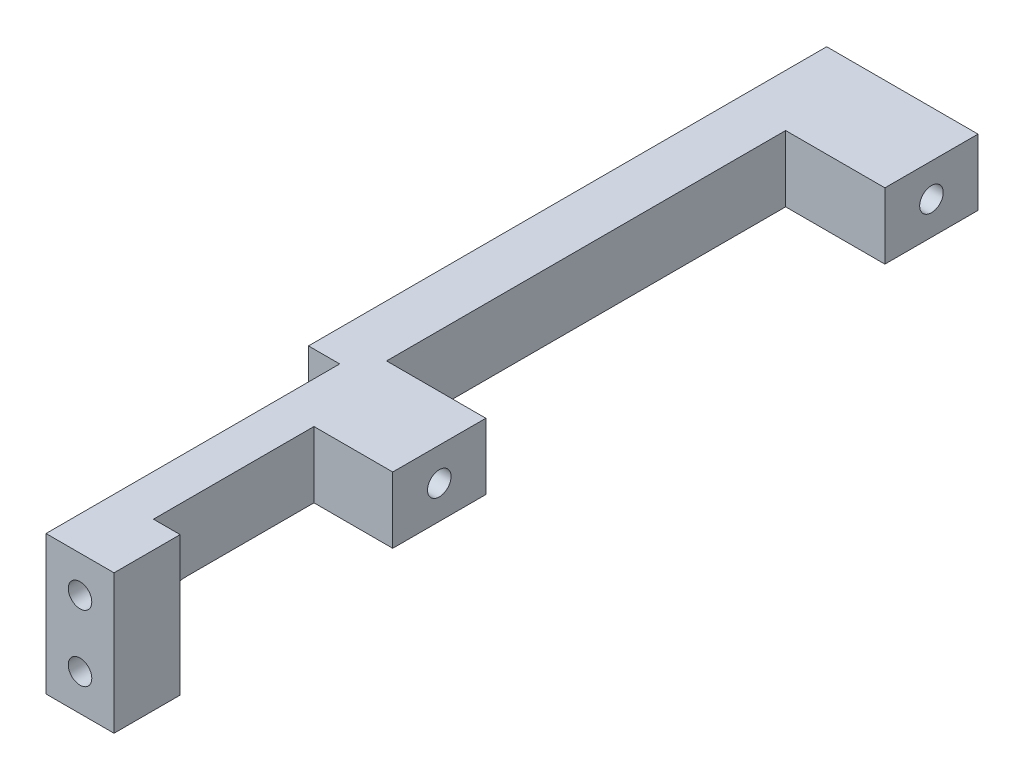
ISO-10303-21;
HEADER;
FILE_DESCRIPTION(('STEP AP214'),'2;1');
FILE_NAME('part.step','',(''),(''),'','','');
FILE_SCHEMA(('AUTOMOTIVE_DESIGN { 1 0 10303 214 1 1 1 1 }'));
ENDSEC;
DATA;
#1=APPLICATION_CONTEXT('core data for automotive mechanical design processes');
#2=APPLICATION_PROTOCOL_DEFINITION('international standard','automotive_design',2000,#1);
#3=PRODUCT_CONTEXT('',#1,'mechanical');
#4=PRODUCT('Part','Part','',(#3));
#5=PRODUCT_RELATED_PRODUCT_CATEGORY('part','',(#4));
#6=PRODUCT_DEFINITION_FORMATION('','',#4);
#7=PRODUCT_DEFINITION_CONTEXT('part definition',#1,'design');
#8=PRODUCT_DEFINITION('design','',#6,#7);
#9=PRODUCT_DEFINITION_SHAPE('','',#8);
#10=(LENGTH_UNIT() NAMED_UNIT(*) SI_UNIT(.MILLI.,.METRE.));
#11=(NAMED_UNIT(*) PLANE_ANGLE_UNIT() SI_UNIT($,.RADIAN.));
#12=(NAMED_UNIT(*) SI_UNIT($,.STERADIAN.) SOLID_ANGLE_UNIT());
#13=UNCERTAINTY_MEASURE_WITH_UNIT(LENGTH_MEASURE(1.E-05),#10,'distance_accuracy_value','');
#14=(GEOMETRIC_REPRESENTATION_CONTEXT(3) GLOBAL_UNCERTAINTY_ASSIGNED_CONTEXT((#13)) GLOBAL_UNIT_ASSIGNED_CONTEXT((#10,
#11,#12)) REPRESENTATION_CONTEXT('',''));
#15=CARTESIAN_POINT('',(0.,0.,0.));
#16=DIRECTION('',(0.,0.,1.));
#17=DIRECTION('',(1.,0.,0.));
#18=AXIS2_PLACEMENT_3D('',#15,#16,#17);
#19=CARTESIAN_POINT('',(0.,0.,0.));
#20=DIRECTION('',(0.,1.,0.));
#21=DIRECTION('',(0.,0.,1.));
#22=AXIS2_PLACEMENT_3D('',#19,#20,#21);
#23=PLANE('',#22);
#24=DIRECTION('',(0.,0.,1.));
#25=VECTOR('',#24,1.);
#26=CARTESIAN_POINT('',(-1.79845000000001,0.,32.639));
#27=LINE('',#26,#25);
#28=CARTESIAN_POINT('',(-1.79845000000001,0.,17.2212));
#29=VERTEX_POINT('',#28);
#30=CARTESIAN_POINT('',(-1.79845000000001,0.,29.464));
#31=VERTEX_POINT('',#30);
#32=EDGE_CURVE('E259',#29,#31,#27,.T.);
#33=ORIENTED_EDGE('',*,*,#32,.T.);
#34=DIRECTION('',(1.,0.,0.));
#35=VECTOR('',#34,1.);
#36=CARTESIAN_POINT('',(-5.7672,0.,29.464));
#37=LINE('',#36,#35);
#38=CARTESIAN_POINT('',(-5.7672,0.,29.464));
#39=VERTEX_POINT('',#38);
#40=EDGE_CURVE('E59',#31,#39,#37,.F.);
#41=ORIENTED_EDGE('',*,*,#40,.T.);
#42=DIRECTION('',(0.,0.,1.));
#43=VECTOR('',#42,1.);
#44=CARTESIAN_POINT('',(-5.76720000000001,0.,-38.989));
#45=LINE('',#44,#43);
#46=CARTESIAN_POINT('',(-5.7672,0.,10.7804));
#47=VERTEX_POINT('',#46);
#48=EDGE_CURVE('E289',#47,#39,#45,.T.);
#49=ORIENTED_EDGE('',*,*,#48,.F.);
#50=DIRECTION('',(-1.,0.,0.));
#51=VECTOR('',#50,1.);
#52=CARTESIAN_POINT('',(-8.76720000000001,0.,10.7804));
#53=LINE('',#52,#51);
#54=CARTESIAN_POINT('',(-8.76720000000001,0.,10.7804));
#55=VERTEX_POINT('',#54);
#56=EDGE_CURVE('E188',#47,#55,#53,.T.);
#57=ORIENTED_EDGE('',*,*,#56,.T.);
#58=DIRECTION('',(0.,0.,-1.));
#59=VECTOR('',#58,1.);
#60=CARTESIAN_POINT('',(-8.76720000000001,0.,10.7804));
#61=LINE('',#60,#59);
#62=CARTESIAN_POINT('',(-8.7672,0.,-38.989));
#63=VERTEX_POINT('',#62);
#64=EDGE_CURVE('E179',#55,#63,#61,.T.);
#65=ORIENTED_EDGE('',*,*,#64,.T.);
#66=DIRECTION('',(-1.,0.,0.));
#67=VECTOR('',#66,1.);
#68=CARTESIAN_POINT('',(-5.76720000000001,0.,-38.989));
#69=LINE('',#68,#67);
#70=CARTESIAN_POINT('',(5.76719999999999,0.,-38.989));
#71=VERTEX_POINT('',#70);
#72=EDGE_CURVE('E299',#71,#63,#69,.T.);
#73=ORIENTED_EDGE('',*,*,#72,.F.);
#74=DIRECTION('',(0.,0.,-1.));
#75=VECTOR('',#74,1.);
#76=CARTESIAN_POINT('',(5.76719999999999,0.,-38.989));
#77=LINE('',#76,#75);
#78=CARTESIAN_POINT('',(5.7672,0.,-30.0482));
#79=VERTEX_POINT('',#78);
#80=EDGE_CURVE('E285',#79,#71,#77,.T.);
#81=ORIENTED_EDGE('',*,*,#80,.F.);
#82=DIRECTION('',(-1.,0.,0.));
#83=VECTOR('',#82,1.);
#84=CARTESIAN_POINT('',(-3.76720000000001,0.,-30.0482));
#85=LINE('',#84,#83);
#86=CARTESIAN_POINT('',(-3.76720000000001,0.,-30.0482));
#87=VERTEX_POINT('',#86);
#88=EDGE_CURVE('E228',#79,#87,#85,.T.);
#89=ORIENTED_EDGE('',*,*,#88,.T.);
#90=DIRECTION('',(0.,0.,1.));
#91=VECTOR('',#90,1.);
#92=CARTESIAN_POINT('',(-3.76720000000001,0.,-30.0482));
#93=LINE('',#92,#91);
#94=CARTESIAN_POINT('',(-3.7672,0.,8.2804));
#95=VERTEX_POINT('',#94);
#96=EDGE_CURVE('E231',#87,#95,#93,.T.);
#97=ORIENTED_EDGE('',*,*,#96,.T.);
#98=DIRECTION('',(1.,0.,0.));
#99=VECTOR('',#98,1.);
#100=CARTESIAN_POINT('',(-3.7672,0.,8.2804));
#101=LINE('',#100,#99);
#102=CARTESIAN_POINT('',(5.76720000000001,0.,8.2804));
#103=VERTEX_POINT('',#102);
#104=EDGE_CURVE('E235',#95,#103,#101,.T.);
#105=ORIENTED_EDGE('',*,*,#104,.T.);
#106=CARTESIAN_POINT('',(5.76720000000001,0.,17.2212));
#107=VERTEX_POINT('',#106);
#108=EDGE_CURVE('E298',#107,#103,#77,.T.);
#109=ORIENTED_EDGE('',*,*,#108,.F.);
#110=DIRECTION('',(-1.,0.,0.));
#111=VECTOR('',#110,1.);
#112=CARTESIAN_POINT('',(-1.79845000000001,0.,17.2212));
#113=LINE('',#112,#111);
#114=EDGE_CURVE('E256',#107,#29,#113,.T.);
#115=ORIENTED_EDGE('',*,*,#114,.T.);
#116=EDGE_LOOP('',(#33,#41,#49,#57,#65,#73,#81,#89,#97,#105,#109,#115));
#117=FACE_BOUND('',#116,.T.);
#118=ADVANCED_FACE('F38',(#117),#23,.F.);
#119=CARTESIAN_POINT('',(5.76719999999999,6.35,-38.989));
#120=DIRECTION('',(-1.,0.,0.));
#121=DIRECTION('',(0.,0.,1.));
#122=AXIS2_PLACEMENT_3D('',#119,#120,#121);
#123=PLANE('',#122);
#124=CARTESIAN_POINT('',(5.7672,3.17499999999999,12.7508));
#125=DIRECTION('',(1.,0.,0.));
#126=DIRECTION('',(0.,0.,-1.));
#127=AXIS2_PLACEMENT_3D('',#124,#125,#126);
#128=CIRCLE('',#127,1.13029999999999);
#129=CARTESIAN_POINT('',(5.7672,3.17499999999999,11.6205));
#130=VERTEX_POINT('',#129);
#131=EDGE_CURVE('E279',#130,#130,#128,.T.);
#132=ORIENTED_EDGE('',*,*,#131,.F.);
#133=EDGE_LOOP('',(#132));
#134=FACE_BOUND('',#133,.T.);
#135=ORIENTED_EDGE('',*,*,#108,.T.);
#136=DIRECTION('',(0.,1.,0.));
#137=VECTOR('',#136,1.);
#138=CARTESIAN_POINT('',(5.76720000000001,0.,8.2804));
#139=LINE('',#138,#137);
#140=CARTESIAN_POINT('',(5.76720000000001,6.35,8.2804));
#141=VERTEX_POINT('',#140);
#142=EDGE_CURVE('E247',#103,#141,#139,.T.);
#143=ORIENTED_EDGE('',*,*,#142,.T.);
#144=DIRECTION('',(0.,0.,-1.));
#145=VECTOR('',#144,1.);
#146=CARTESIAN_POINT('',(5.76719999999999,6.35,-38.989));
#147=LINE('',#146,#145);
#148=CARTESIAN_POINT('',(5.76720000000001,6.35,17.2212));
#149=VERTEX_POINT('',#148);
#150=EDGE_CURVE('E288',#149,#141,#147,.T.);
#151=ORIENTED_EDGE('',*,*,#150,.F.);
#152=DIRECTION('',(0.,1.,0.));
#153=VECTOR('',#152,1.);
#154=CARTESIAN_POINT('',(5.76720000000001,0.,17.2212));
#155=LINE('',#154,#153);
#156=EDGE_CURVE('E262',#107,#149,#155,.T.);
#157=ORIENTED_EDGE('',*,*,#156,.F.);
#158=EDGE_LOOP('',(#135,#143,#151,#157));
#159=FACE_BOUND('',#158,.T.);
#160=ADVANCED_FACE('F342',(#134,#159),#123,.F.);
#161=CARTESIAN_POINT('',(5.7672,3.175,-34.5186));
#162=DIRECTION('',(1.,0.,0.));
#163=DIRECTION('',(0.,0.,-1.));
#164=AXIS2_PLACEMENT_3D('',#161,#162,#163);
#165=CIRCLE('',#164,1.13029999999999);
#166=CARTESIAN_POINT('',(5.7672,3.175,-35.6489));
#167=VERTEX_POINT('',#166);
#168=EDGE_CURVE('E250',#167,#167,#165,.T.);
#169=ORIENTED_EDGE('',*,*,#168,.F.);
#170=EDGE_LOOP('',(#169));
#171=FACE_BOUND('',#170,.T.);
#172=CARTESIAN_POINT('',(5.7672,6.35,-30.0482));
#173=VERTEX_POINT('',#172);
#174=CARTESIAN_POINT('',(5.76719999999999,6.35,-38.989));
#175=VERTEX_POINT('',#174);
#176=EDGE_CURVE('E286',#173,#175,#147,.T.);
#177=ORIENTED_EDGE('',*,*,#176,.F.);
#178=DIRECTION('',(0.,1.,0.));
#179=VECTOR('',#178,1.);
#180=CARTESIAN_POINT('',(5.7672,0.,-30.0482));
#181=LINE('',#180,#179);
#182=EDGE_CURVE('E238',#79,#173,#181,.T.);
#183=ORIENTED_EDGE('',*,*,#182,.F.);
#184=ORIENTED_EDGE('',*,*,#80,.T.);
#185=DIRECTION('',(0.,-1.,0.));
#186=VECTOR('',#185,1.);
#187=CARTESIAN_POINT('',(5.76719999999999,6.35,-38.989));
#188=LINE('',#187,#186);
#189=EDGE_CURVE('E303',#175,#71,#188,.T.);
#190=ORIENTED_EDGE('',*,*,#189,.F.);
#191=EDGE_LOOP('',(#177,#183,#184,#190));
#192=FACE_BOUND('',#191,.T.);
#193=ADVANCED_FACE('F325',(#171,#192),#123,.F.);
#194=CARTESIAN_POINT('',(-5.76720000000001,6.35,-38.989));
#195=DIRECTION('',(0.,0.,1.));
#196=DIRECTION('',(1.,0.,0.));
#197=AXIS2_PLACEMENT_3D('',#194,#195,#196);
#198=PLANE('',#197);
#199=ORIENTED_EDGE('',*,*,#72,.T.);
#200=DIRECTION('',(0.,-1.,0.));
#201=VECTOR('',#200,1.);
#202=CARTESIAN_POINT('',(-8.7672,56.2097350209565,-38.989));
#203=LINE('',#202,#201);
#204=CARTESIAN_POINT('',(-8.7672,6.35,-38.989));
#205=VERTEX_POINT('',#204);
#206=EDGE_CURVE('E173',#205,#63,#203,.T.);
#207=ORIENTED_EDGE('',*,*,#206,.F.);
#208=DIRECTION('',(-1.,0.,0.));
#209=VECTOR('',#208,1.);
#210=CARTESIAN_POINT('',(-5.76720000000001,6.35,-38.989));
#211=LINE('',#210,#209);
#212=EDGE_CURVE('E169',#175,#205,#211,.T.);
#213=ORIENTED_EDGE('',*,*,#212,.F.);
#214=ORIENTED_EDGE('',*,*,#189,.T.);
#215=EDGE_LOOP('',(#199,#207,#213,#214));
#216=FACE_BOUND('',#215,.T.);
#217=ADVANCED_FACE('F322',(#216),#198,.F.);
#218=CARTESIAN_POINT('',(-5.76720000000001,6.35,-38.989));
#219=DIRECTION('',(1.,0.,0.));
#220=DIRECTION('',(0.,0.,-1.));
#221=AXIS2_PLACEMENT_3D('',#218,#219,#220);
#222=PLANE('',#221);
#223=DIRECTION('',(0.,0.,1.));
#224=VECTOR('',#223,1.);
#225=CARTESIAN_POINT('',(-5.76720000000001,6.35,-38.989));
#226=LINE('',#225,#224);
#227=CARTESIAN_POINT('',(-5.76720000000001,6.35,10.7804));
#228=VERTEX_POINT('',#227);
#229=CARTESIAN_POINT('',(-5.7672,6.35,38.989));
#230=VERTEX_POINT('',#229);
#231=EDGE_CURVE('E291',#228,#230,#226,.T.);
#232=ORIENTED_EDGE('',*,*,#231,.F.);
#233=DIRECTION('',(0.,-1.,0.));
#234=VECTOR('',#233,1.);
#235=CARTESIAN_POINT('',(-5.76720000000001,56.2097350209565,10.7804));
#236=LINE('',#235,#234);
#237=EDGE_CURVE('E185',#228,#47,#236,.T.);
#238=ORIENTED_EDGE('',*,*,#237,.T.);
#239=ORIENTED_EDGE('',*,*,#48,.T.);
#240=CARTESIAN_POINT('',(-5.7672,-3.175,29.464));
#241=DIRECTION('',(1.,0.,0.));
#242=DIRECTION('',(0.,0.,-1.));
#243=AXIS2_PLACEMENT_3D('',#240,#241,#242);
#244=CIRCLE('',#243,3.175);
#245=CARTESIAN_POINT('',(-5.7672,-3.175,32.639));
#246=VERTEX_POINT('',#245);
#247=EDGE_CURVE('E11',#39,#246,#244,.T.);
#248=ORIENTED_EDGE('',*,*,#247,.T.);
#249=DIRECTION('',(0.,1.,0.));
#250=VECTOR('',#249,1.);
#251=CARTESIAN_POINT('',(-5.7672,-7.,32.639));
#252=LINE('',#251,#250);
#253=CARTESIAN_POINT('',(-5.7672,-7.,32.639));
#254=VERTEX_POINT('',#253);
#255=EDGE_CURVE('E207',#254,#246,#252,.T.);
#256=ORIENTED_EDGE('',*,*,#255,.F.);
#257=DIRECTION('',(0.,0.,1.));
#258=VECTOR('',#257,1.);
#259=CARTESIAN_POINT('',(-5.7672,-7.,23.0630727153972));
#260=LINE('',#259,#258);
#261=CARTESIAN_POINT('',(-5.7672,-7.,38.989));
#262=VERTEX_POINT('',#261);
#263=EDGE_CURVE('E216',#254,#262,#260,.T.);
#264=ORIENTED_EDGE('',*,*,#263,.T.);
#265=DIRECTION('',(0.,-1.,0.));
#266=VECTOR('',#265,1.);
#267=CARTESIAN_POINT('',(-5.7672,6.35,38.989));
#268=LINE('',#267,#266);
#269=EDGE_CURVE('E296',#230,#262,#268,.T.);
#270=ORIENTED_EDGE('',*,*,#269,.F.);
#271=EDGE_LOOP('',(#232,#238,#239,#248,#256,#264,#270));
#272=FACE_BOUND('',#271,.T.);
#273=ADVANCED_FACE('F316',(#272),#222,.F.);
#274=CARTESIAN_POINT('',(-5.7672,6.35,38.989));
#275=DIRECTION('',(0.,0.,-1.));
#276=DIRECTION('',(-1.,0.,0.));
#277=AXIS2_PLACEMENT_3D('',#274,#275,#276);
#278=PLANE('',#277);
#279=CARTESIAN_POINT('',(-2.49999999999999,2.85,38.989));
#280=DIRECTION('',(0.,0.,1.));
#281=DIRECTION('',(1.,0.,0.));
#282=AXIS2_PLACEMENT_3D('',#279,#280,#281);
#283=CIRCLE('',#282,1.13029999999999);
#284=CARTESIAN_POINT('',(-1.36970000000001,2.85,38.989));
#285=VERTEX_POINT('',#284);
#286=EDGE_CURVE('E194',#285,#285,#283,.T.);
#287=ORIENTED_EDGE('',*,*,#286,.F.);
#288=EDGE_LOOP('',(#287));
#289=FACE_BOUND('',#288,.T.);
#290=CARTESIAN_POINT('',(-2.49999999999999,-3.5,38.989));
#291=DIRECTION('',(0.,0.,1.));
#292=DIRECTION('',(1.,0.,0.));
#293=AXIS2_PLACEMENT_3D('',#290,#291,#292);
#294=CIRCLE('',#293,1.13029999999999);
#295=CARTESIAN_POINT('',(-1.36970000000001,-3.5,38.989));
#296=VERTEX_POINT('',#295);
#297=EDGE_CURVE('E200',#296,#296,#294,.T.);
#298=ORIENTED_EDGE('',*,*,#297,.F.);
#299=EDGE_LOOP('',(#298));
#300=FACE_BOUND('',#299,.T.);
#301=ORIENTED_EDGE('',*,*,#269,.T.);
#302=DIRECTION('',(1.,0.,0.));
#303=VECTOR('',#302,1.);
#304=CARTESIAN_POINT('',(-5.7672,-7.,38.989));
#305=LINE('',#304,#303);
#306=CARTESIAN_POINT('',(0.767200000000005,-7.,38.989));
#307=VERTEX_POINT('',#306);
#308=EDGE_CURVE('E206',#262,#307,#305,.T.);
#309=ORIENTED_EDGE('',*,*,#308,.T.);
#310=DIRECTION('',(0.,1.,0.));
#311=VECTOR('',#310,1.);
#312=CARTESIAN_POINT('',(0.767200000000005,0.,38.989));
#313=LINE('',#312,#311);
#314=CARTESIAN_POINT('',(0.767200000000005,6.35,38.989));
#315=VERTEX_POINT('',#314);
#316=EDGE_CURVE('E223',#307,#315,#313,.T.);
#317=ORIENTED_EDGE('',*,*,#316,.T.);
#318=DIRECTION('',(1.,0.,0.));
#319=VECTOR('',#318,1.);
#320=CARTESIAN_POINT('',(-5.7672,6.35,38.989));
#321=LINE('',#320,#319);
#322=EDGE_CURVE('E293',#230,#315,#321,.T.);
#323=ORIENTED_EDGE('',*,*,#322,.F.);
#324=EDGE_LOOP('',(#301,#309,#317,#323));
#325=FACE_BOUND('',#324,.T.);
#326=ADVANCED_FACE('F370',(#289,#300,#325),#278,.F.);
#327=CARTESIAN_POINT('',(0.,6.35,0.));
#328=DIRECTION('',(0.,1.,0.));
#329=DIRECTION('',(0.,0.,1.));
#330=AXIS2_PLACEMENT_3D('',#327,#328,#329);
#331=PLANE('',#330);
#332=DIRECTION('',(0.,0.,1.));
#333=VECTOR('',#332,1.);
#334=CARTESIAN_POINT('',(0.767200000000005,6.35,38.989));
#335=LINE('',#334,#333);
#336=CARTESIAN_POINT('',(0.767200000000005,6.35,32.639));
#337=VERTEX_POINT('',#336);
#338=EDGE_CURVE('E213',#337,#315,#335,.T.);
#339=ORIENTED_EDGE('',*,*,#338,.F.);
#340=DIRECTION('',(1.,0.,0.));
#341=VECTOR('',#340,1.);
#342=CARTESIAN_POINT('',(-1.79845000000001,6.35,32.639));
#343=LINE('',#342,#341);
#344=CARTESIAN_POINT('',(-1.79845000000001,6.35,32.639));
#345=VERTEX_POINT('',#344);
#346=EDGE_CURVE('E260',#345,#337,#343,.T.);
#347=ORIENTED_EDGE('',*,*,#346,.F.);
#348=DIRECTION('',(0.,0.,1.));
#349=VECTOR('',#348,1.);
#350=CARTESIAN_POINT('',(-1.79845000000001,6.35,32.639));
#351=LINE('',#350,#349);
#352=CARTESIAN_POINT('',(-1.79845000000001,6.35,17.2212));
#353=VERTEX_POINT('',#352);
#354=EDGE_CURVE('E265',#353,#345,#351,.T.);
#355=ORIENTED_EDGE('',*,*,#354,.F.);
#356=DIRECTION('',(-1.,0.,0.));
#357=VECTOR('',#356,1.);
#358=CARTESIAN_POINT('',(-1.79845000000001,6.35,17.2212));
#359=LINE('',#358,#357);
#360=EDGE_CURVE('E226',#149,#353,#359,.T.);
#361=ORIENTED_EDGE('',*,*,#360,.F.);
#362=ORIENTED_EDGE('',*,*,#150,.T.);
#363=DIRECTION('',(1.,0.,0.));
#364=VECTOR('',#363,1.);
#365=CARTESIAN_POINT('',(-3.7672,6.35,8.2804));
#366=LINE('',#365,#364);
#367=CARTESIAN_POINT('',(-3.7672,6.35,8.2804));
#368=VERTEX_POINT('',#367);
#369=EDGE_CURVE('E232',#368,#141,#366,.T.);
#370=ORIENTED_EDGE('',*,*,#369,.F.);
#371=DIRECTION('',(0.,0.,1.));
#372=VECTOR('',#371,1.);
#373=CARTESIAN_POINT('',(-3.76720000000001,6.35,-30.0482));
#374=LINE('',#373,#372);
#375=CARTESIAN_POINT('',(-3.76720000000001,6.35,-30.0482));
#376=VERTEX_POINT('',#375);
#377=EDGE_CURVE('E242',#376,#368,#374,.T.);
#378=ORIENTED_EDGE('',*,*,#377,.F.);
#379=DIRECTION('',(-1.,0.,0.));
#380=VECTOR('',#379,1.);
#381=CARTESIAN_POINT('',(-3.76720000000001,6.35,-30.0482));
#382=LINE('',#381,#380);
#383=EDGE_CURVE('E239',#173,#376,#382,.T.);
#384=ORIENTED_EDGE('',*,*,#383,.F.);
#385=ORIENTED_EDGE('',*,*,#176,.T.);
#386=ORIENTED_EDGE('',*,*,#212,.T.);
#387=DIRECTION('',(0.,0.,-1.));
#388=VECTOR('',#387,1.);
#389=CARTESIAN_POINT('',(-8.76720000000001,6.35,10.7804));
#390=LINE('',#389,#388);
#391=CARTESIAN_POINT('',(-8.76720000000001,6.35000000000002,10.7804));
#392=VERTEX_POINT('',#391);
#393=EDGE_CURVE('E161',#392,#205,#390,.T.);
#394=ORIENTED_EDGE('',*,*,#393,.F.);
#395=DIRECTION('',(-1.,0.,0.));
#396=VECTOR('',#395,1.);
#397=CARTESIAN_POINT('',(-8.76720000000001,6.35,10.7804));
#398=LINE('',#397,#396);
#399=EDGE_CURVE('E166',#228,#392,#398,.T.);
#400=ORIENTED_EDGE('',*,*,#399,.F.);
#401=ORIENTED_EDGE('',*,*,#231,.T.);
#402=ORIENTED_EDGE('',*,*,#322,.T.);
#403=EDGE_LOOP('',(#339,#347,#355,#361,#362,#370,#378,#384,#385,#386,#394,#400,#401,#402));
#404=FACE_BOUND('',#403,.T.);
#405=ADVANCED_FACE('F164',(#404),#331,.T.);
#406=CARTESIAN_POINT('',(-0.582799999999998,3.17499999999999,12.7508));
#407=DIRECTION('',(1.,0.,0.));
#408=DIRECTION('',(0.,0.,-1.));
#409=AXIS2_PLACEMENT_3D('',#406,#407,#408);
#410=CONICAL_SURFACE('',#409,1.1303,1.02974425867665);
#411=CARTESIAN_POINT('',(-1.26195275768685,3.17499999999999,12.7508));
#412=VERTEX_POINT('',#411);
#413=VERTEX_LOOP('',#412);
#414=FACE_BOUND('',#413,.T.);
#415=CARTESIAN_POINT('',(-0.582799999999998,3.17499999999999,12.7508));
#416=DIRECTION('',(1.,0.,0.));
#417=DIRECTION('',(0.,0.,-1.));
#418=AXIS2_PLACEMENT_3D('',#415,#416,#417);
#419=CIRCLE('',#418,1.1303);
#420=CARTESIAN_POINT('',(-0.582799999999998,3.17499999999999,11.6205));
#421=VERTEX_POINT('',#420);
#422=EDGE_CURVE('E282',#421,#421,#419,.T.);
#423=ORIENTED_EDGE('',*,*,#422,.T.);
#424=EDGE_LOOP('',(#423));
#425=FACE_BOUND('',#424,.T.);
#426=ADVANCED_FACE('F396',(#414,#425),#410,.F.);
#427=CARTESIAN_POINT('',(5.7672,3.17499999999999,12.7508));
#428=DIRECTION('',(1.,0.,0.));
#429=DIRECTION('',(0.,0.,-1.));
#430=AXIS2_PLACEMENT_3D('',#427,#428,#429);
#431=CYLINDRICAL_SURFACE('',#430,1.13029999999999);
#432=ORIENTED_EDGE('',*,*,#422,.F.);
#433=EDGE_LOOP('',(#432));
#434=FACE_BOUND('',#433,.T.);
#435=ORIENTED_EDGE('',*,*,#131,.T.);
#436=EDGE_LOOP('',(#435));
#437=FACE_BOUND('',#436,.T.);
#438=ADVANCED_FACE('F390',(#434,#437),#431,.F.);
#439=CARTESIAN_POINT('',(-0.582800000000004,3.175,-34.5186));
#440=DIRECTION('',(1.,0.,0.));
#441=DIRECTION('',(0.,0.,-1.));
#442=AXIS2_PLACEMENT_3D('',#439,#440,#441);
#443=CONICAL_SURFACE('',#442,1.1303,1.02974425867665);
#444=CARTESIAN_POINT('',(-1.26195275768686,3.175,-34.5186));
#445=VERTEX_POINT('',#444);
#446=VERTEX_LOOP('',#445);
#447=FACE_BOUND('',#446,.T.);
#448=CARTESIAN_POINT('',(-0.582800000000004,3.175,-34.5186));
#449=DIRECTION('',(1.,0.,0.));
#450=DIRECTION('',(0.,0.,-1.));
#451=AXIS2_PLACEMENT_3D('',#448,#449,#450);
#452=CIRCLE('',#451,1.1303);
#453=CARTESIAN_POINT('',(-0.582800000000004,3.175,-35.6489));
#454=VERTEX_POINT('',#453);
#455=EDGE_CURVE('E276',#454,#454,#452,.T.);
#456=ORIENTED_EDGE('',*,*,#455,.T.);
#457=EDGE_LOOP('',(#456));
#458=FACE_BOUND('',#457,.T.);
#459=ADVANCED_FACE('F384',(#447,#458),#443,.F.);
#460=CARTESIAN_POINT('',(5.7672,3.175,-34.5186));
#461=DIRECTION('',(1.,0.,0.));
#462=DIRECTION('',(0.,0.,-1.));
#463=AXIS2_PLACEMENT_3D('',#460,#461,#462);
#464=CYLINDRICAL_SURFACE('',#463,1.13029999999999);
#465=ORIENTED_EDGE('',*,*,#455,.F.);
#466=EDGE_LOOP('',(#465));
#467=FACE_BOUND('',#466,.T.);
#468=ORIENTED_EDGE('',*,*,#168,.T.);
#469=EDGE_LOOP('',(#468));
#470=FACE_BOUND('',#469,.T.);
#471=ADVANCED_FACE('F359',(#467,#470),#464,.F.);
#472=CARTESIAN_POINT('',(-1.79845000000001,0.,32.639));
#473=DIRECTION('',(0.,0.,1.));
#474=DIRECTION('',(1.,0.,0.));
#475=AXIS2_PLACEMENT_3D('',#472,#473,#474);
#476=PLANE('',#475);
#477=ORIENTED_EDGE('',*,*,#255,.T.);
#478=DIRECTION('',(1.,0.,0.));
#479=VECTOR('',#478,1.);
#480=CARTESIAN_POINT('',(-1.79845000000001,-3.175,32.639));
#481=LINE('',#480,#479);
#482=CARTESIAN_POINT('',(-1.79845000000001,-3.175,32.639));
#483=VERTEX_POINT('',#482);
#484=EDGE_CURVE('E306',#246,#483,#481,.T.);
#485=ORIENTED_EDGE('',*,*,#484,.T.);
#486=DIRECTION('',(0.,1.,0.));
#487=VECTOR('',#486,1.);
#488=CARTESIAN_POINT('',(-1.79845000000001,0.,32.639));
#489=LINE('',#488,#487);
#490=EDGE_CURVE('E243',#483,#345,#489,.T.);
#491=ORIENTED_EDGE('',*,*,#490,.T.);
#492=ORIENTED_EDGE('',*,*,#346,.T.);
#493=DIRECTION('',(0.,1.,0.));
#494=VECTOR('',#493,1.);
#495=CARTESIAN_POINT('',(0.767200000000005,0.,32.639));
#496=LINE('',#495,#494);
#497=CARTESIAN_POINT('',(0.767200000000005,-7.,32.639));
#498=VERTEX_POINT('',#497);
#499=EDGE_CURVE('E222',#498,#337,#496,.T.);
#500=ORIENTED_EDGE('',*,*,#499,.F.);
#501=DIRECTION('',(-1.,0.,0.));
#502=VECTOR('',#501,1.);
#503=CARTESIAN_POINT('',(-5.7672,-7.,32.639));
#504=LINE('',#503,#502);
#505=EDGE_CURVE('E210',#498,#254,#504,.T.);
#506=ORIENTED_EDGE('',*,*,#505,.T.);
#507=EDGE_LOOP('',(#477,#485,#491,#492,#500,#506));
#508=FACE_BOUND('',#507,.T.);
#509=ADVANCED_FACE('F311',(#508),#476,.F.);
#510=CARTESIAN_POINT('',(-1.79845000000001,0.,32.639));
#511=DIRECTION('',(-1.,0.,0.));
#512=DIRECTION('',(0.,0.,1.));
#513=AXIS2_PLACEMENT_3D('',#510,#511,#512);
#514=PLANE('',#513);
#515=ORIENTED_EDGE('',*,*,#354,.T.);
#516=ORIENTED_EDGE('',*,*,#490,.F.);
#517=CARTESIAN_POINT('',(-1.79845000000001,-3.175,29.464));
#518=DIRECTION('',(-1.,0.,0.));
#519=DIRECTION('',(0.,0.,1.));
#520=AXIS2_PLACEMENT_3D('',#517,#518,#519);
#521=CIRCLE('',#520,3.175);
#522=EDGE_CURVE('E46',#483,#31,#521,.T.);
#523=ORIENTED_EDGE('',*,*,#522,.T.);
#524=ORIENTED_EDGE('',*,*,#32,.F.);
#525=DIRECTION('',(0.,1.,0.));
#526=VECTOR('',#525,1.);
#527=CARTESIAN_POINT('',(-1.79845000000001,0.,17.2212));
#528=LINE('',#527,#526);
#529=EDGE_CURVE('E271',#29,#353,#528,.T.);
#530=ORIENTED_EDGE('',*,*,#529,.T.);
#531=EDGE_LOOP('',(#515,#516,#523,#524,#530));
#532=FACE_BOUND('',#531,.T.);
#533=ADVANCED_FACE('F350',(#532),#514,.F.);
#534=CARTESIAN_POINT('',(-1.79845000000001,0.,17.2212));
#535=DIRECTION('',(0.,0.,-1.));
#536=DIRECTION('',(-1.,0.,0.));
#537=AXIS2_PLACEMENT_3D('',#534,#535,#536);
#538=PLANE('',#537);
#539=ORIENTED_EDGE('',*,*,#360,.T.);
#540=ORIENTED_EDGE('',*,*,#529,.F.);
#541=ORIENTED_EDGE('',*,*,#114,.F.);
#542=ORIENTED_EDGE('',*,*,#156,.T.);
#543=EDGE_LOOP('',(#539,#540,#541,#542));
#544=FACE_BOUND('',#543,.T.);
#545=ADVANCED_FACE('F346',(#544),#538,.F.);
#546=CARTESIAN_POINT('',(-3.7672,0.,8.2804));
#547=DIRECTION('',(0.,0.,1.));
#548=DIRECTION('',(1.,0.,0.));
#549=AXIS2_PLACEMENT_3D('',#546,#547,#548);
#550=PLANE('',#549);
#551=ORIENTED_EDGE('',*,*,#369,.T.);
#552=ORIENTED_EDGE('',*,*,#142,.F.);
#553=ORIENTED_EDGE('',*,*,#104,.F.);
#554=DIRECTION('',(0.,1.,0.));
#555=VECTOR('',#554,1.);
#556=CARTESIAN_POINT('',(-3.7672,0.,8.2804));
#557=LINE('',#556,#555);
#558=EDGE_CURVE('E251',#95,#368,#557,.T.);
#559=ORIENTED_EDGE('',*,*,#558,.T.);
#560=EDGE_LOOP('',(#551,#552,#553,#559));
#561=FACE_BOUND('',#560,.T.);
#562=ADVANCED_FACE('F357',(#561),#550,.F.);
#563=CARTESIAN_POINT('',(-3.76720000000001,0.,-30.0482));
#564=DIRECTION('',(-1.,0.,0.));
#565=DIRECTION('',(0.,0.,1.));
#566=AXIS2_PLACEMENT_3D('',#563,#564,#565);
#567=PLANE('',#566);
#568=ORIENTED_EDGE('',*,*,#377,.T.);
#569=ORIENTED_EDGE('',*,*,#558,.F.);
#570=ORIENTED_EDGE('',*,*,#96,.F.);
#571=DIRECTION('',(0.,1.,0.));
#572=VECTOR('',#571,1.);
#573=CARTESIAN_POINT('',(-3.76720000000001,0.,-30.0482));
#574=LINE('',#573,#572);
#575=EDGE_CURVE('E253',#87,#376,#574,.T.);
#576=ORIENTED_EDGE('',*,*,#575,.T.);
#577=EDGE_LOOP('',(#568,#569,#570,#576));
#578=FACE_BOUND('',#577,.T.);
#579=ADVANCED_FACE('F335',(#578),#567,.F.);
#580=CARTESIAN_POINT('',(-3.76720000000001,0.,-30.0482));
#581=DIRECTION('',(0.,0.,-1.));
#582=DIRECTION('',(-1.,0.,0.));
#583=AXIS2_PLACEMENT_3D('',#580,#581,#582);
#584=PLANE('',#583);
#585=ORIENTED_EDGE('',*,*,#383,.T.);
#586=ORIENTED_EDGE('',*,*,#575,.F.);
#587=ORIENTED_EDGE('',*,*,#88,.F.);
#588=ORIENTED_EDGE('',*,*,#182,.T.);
#589=EDGE_LOOP('',(#585,#586,#587,#588));
#590=FACE_BOUND('',#589,.T.);
#591=ADVANCED_FACE('F329',(#590),#584,.F.);
#592=CARTESIAN_POINT('',(0.767200000000005,0.,38.989));
#593=DIRECTION('',(-1.,0.,0.));
#594=DIRECTION('',(0.,0.,1.));
#595=AXIS2_PLACEMENT_3D('',#592,#593,#594);
#596=PLANE('',#595);
#597=ORIENTED_EDGE('',*,*,#338,.T.);
#598=ORIENTED_EDGE('',*,*,#316,.F.);
#599=DIRECTION('',(0.,0.,1.));
#600=VECTOR('',#599,1.);
#601=CARTESIAN_POINT('',(0.767200000000005,-7.,23.0630727153972));
#602=LINE('',#601,#600);
#603=EDGE_CURVE('E211',#498,#307,#602,.T.);
#604=ORIENTED_EDGE('',*,*,#603,.F.);
#605=ORIENTED_EDGE('',*,*,#499,.T.);
#606=EDGE_LOOP('',(#597,#598,#604,#605));
#607=FACE_BOUND('',#606,.T.);
#608=ADVANCED_FACE('F480',(#607),#596,.F.);
#609=CARTESIAN_POINT('',(-5.7672,-7.,23.0630727153972));
#610=DIRECTION('',(0.,-1.,0.));
#611=DIRECTION('',(0.,0.,-1.));
#612=AXIS2_PLACEMENT_3D('',#609,#610,#611);
#613=PLANE('',#612);
#614=ORIENTED_EDGE('',*,*,#505,.F.);
#615=ORIENTED_EDGE('',*,*,#603,.T.);
#616=ORIENTED_EDGE('',*,*,#308,.F.);
#617=ORIENTED_EDGE('',*,*,#263,.F.);
#618=EDGE_LOOP('',(#614,#615,#616,#617));
#619=FACE_BOUND('',#618,.T.);
#620=ADVANCED_FACE('F469',(#619),#613,.T.);
#621=CARTESIAN_POINT('',(-2.49999999999999,-3.5,33.989));
#622=DIRECTION('',(0.,0.,1.));
#623=DIRECTION('',(1.,0.,0.));
#624=AXIS2_PLACEMENT_3D('',#621,#622,#623);
#625=CONICAL_SURFACE('',#624,1.1303,1.02974425867666);
#626=CARTESIAN_POINT('',(-2.5,-3.5,33.3098472423132));
#627=VERTEX_POINT('',#626);
#628=VERTEX_LOOP('',#627);
#629=FACE_BOUND('',#628,.T.);
#630=CARTESIAN_POINT('',(-2.49999999999999,-3.5,33.989));
#631=DIRECTION('',(0.,0.,1.));
#632=DIRECTION('',(1.,0.,0.));
#633=AXIS2_PLACEMENT_3D('',#630,#631,#632);
#634=CIRCLE('',#633,1.1303);
#635=CARTESIAN_POINT('',(-1.3697,-3.5,33.989));
#636=VERTEX_POINT('',#635);
#637=EDGE_CURVE('E203',#636,#636,#634,.T.);
#638=ORIENTED_EDGE('',*,*,#637,.T.);
#639=EDGE_LOOP('',(#638));
#640=FACE_BOUND('',#639,.T.);
#641=ADVANCED_FACE('F459',(#629,#640),#625,.F.);
#642=CARTESIAN_POINT('',(-2.49999999999999,-3.5,38.989));
#643=DIRECTION('',(0.,0.,1.));
#644=DIRECTION('',(1.,0.,0.));
#645=AXIS2_PLACEMENT_3D('',#642,#643,#644);
#646=CYLINDRICAL_SURFACE('',#645,1.13029999999999);
#647=ORIENTED_EDGE('',*,*,#637,.F.);
#648=EDGE_LOOP('',(#647));
#649=FACE_BOUND('',#648,.T.);
#650=ORIENTED_EDGE('',*,*,#297,.T.);
#651=EDGE_LOOP('',(#650));
#652=FACE_BOUND('',#651,.T.);
#653=ADVANCED_FACE('F450',(#649,#652),#646,.F.);
#654=CARTESIAN_POINT('',(-2.49999999999999,2.85,33.989));
#655=DIRECTION('',(0.,0.,1.));
#656=DIRECTION('',(1.,0.,0.));
#657=AXIS2_PLACEMENT_3D('',#654,#655,#656);
#658=CONICAL_SURFACE('',#657,1.1303,1.02974425867666);
#659=CARTESIAN_POINT('',(-2.5,2.85,33.3098472423132));
#660=VERTEX_POINT('',#659);
#661=VERTEX_LOOP('',#660);
#662=FACE_BOUND('',#661,.T.);
#663=CARTESIAN_POINT('',(-2.49999999999999,2.85,33.989));
#664=DIRECTION('',(0.,0.,1.));
#665=DIRECTION('',(1.,0.,0.));
#666=AXIS2_PLACEMENT_3D('',#663,#664,#665);
#667=CIRCLE('',#666,1.1303);
#668=CARTESIAN_POINT('',(-1.3697,2.85,33.989));
#669=VERTEX_POINT('',#668);
#670=EDGE_CURVE('E197',#669,#669,#667,.T.);
#671=ORIENTED_EDGE('',*,*,#670,.T.);
#672=EDGE_LOOP('',(#671));
#673=FACE_BOUND('',#672,.T.);
#674=ADVANCED_FACE('F438',(#662,#673),#658,.F.);
#675=CARTESIAN_POINT('',(-2.49999999999999,2.85,38.989));
#676=DIRECTION('',(0.,0.,1.));
#677=DIRECTION('',(1.,0.,0.));
#678=AXIS2_PLACEMENT_3D('',#675,#676,#677);
#679=CYLINDRICAL_SURFACE('',#678,1.13029999999999);
#680=ORIENTED_EDGE('',*,*,#670,.F.);
#681=EDGE_LOOP('',(#680));
#682=FACE_BOUND('',#681,.T.);
#683=ORIENTED_EDGE('',*,*,#286,.T.);
#684=EDGE_LOOP('',(#683));
#685=FACE_BOUND('',#684,.T.);
#686=ADVANCED_FACE('F432',(#682,#685),#679,.F.);
#687=CARTESIAN_POINT('',(-8.76720000000001,56.2097350209565,10.7804));
#688=DIRECTION('',(0.,0.,1.));
#689=DIRECTION('',(1.,0.,0.));
#690=AXIS2_PLACEMENT_3D('',#687,#688,#689);
#691=PLANE('',#690);
#692=ORIENTED_EDGE('',*,*,#237,.F.);
#693=ORIENTED_EDGE('',*,*,#399,.T.);
#694=DIRECTION('',(0.,-1.,0.));
#695=VECTOR('',#694,1.);
#696=CARTESIAN_POINT('',(-8.76720000000001,56.2097350209565,10.7804));
#697=LINE('',#696,#695);
#698=EDGE_CURVE('E174',#392,#55,#697,.T.);
#699=ORIENTED_EDGE('',*,*,#698,.T.);
#700=ORIENTED_EDGE('',*,*,#56,.F.);
#701=EDGE_LOOP('',(#692,#693,#699,#700));
#702=FACE_BOUND('',#701,.T.);
#703=ADVANCED_FACE('F183',(#702),#691,.T.);
#704=CARTESIAN_POINT('',(-8.76720000000001,56.2097350209565,10.7804));
#705=DIRECTION('',(-1.,0.,0.));
#706=DIRECTION('',(0.,0.,1.));
#707=AXIS2_PLACEMENT_3D('',#704,#705,#706);
#708=PLANE('',#707);
#709=ORIENTED_EDGE('',*,*,#698,.F.);
#710=ORIENTED_EDGE('',*,*,#393,.T.);
#711=ORIENTED_EDGE('',*,*,#206,.T.);
#712=ORIENTED_EDGE('',*,*,#64,.F.);
#713=EDGE_LOOP('',(#709,#710,#711,#712));
#714=FACE_BOUND('',#713,.T.);
#715=ADVANCED_FACE('F177',(#714),#708,.T.);
#716=CARTESIAN_POINT('',(-1.79845000000001,-3.175,29.464));
#717=DIRECTION('',(-1.,0.,0.));
#718=DIRECTION('',(0.,0.,1.));
#719=AXIS2_PLACEMENT_3D('',#716,#717,#718);
#720=CYLINDRICAL_SURFACE('',#719,3.175);
#721=ORIENTED_EDGE('',*,*,#247,.F.);
#722=ORIENTED_EDGE('',*,*,#40,.F.);
#723=ORIENTED_EDGE('',*,*,#522,.F.);
#724=ORIENTED_EDGE('',*,*,#484,.F.);
#725=EDGE_LOOP('',(#721,#722,#723,#724));
#726=FACE_BOUND('',#725,.T.);
#727=ADVANCED_FACE('F40',(#726),#720,.F.);
#728=CLOSED_SHELL('',(#118,#160,#193,#217,#273,#326,#405,#426,#438,#459,#471,#509,#533,#545,
#562,#579,#591,#608,#620,#641,#653,#674,#686,#703,#715,#727));
#729=MANIFOLD_SOLID_BREP('B2',#728);
#730=ADVANCED_BREP_SHAPE_REPRESENTATION('',(#18,#729),#14);
#731=SHAPE_DEFINITION_REPRESENTATION(#9,#730);
ENDSEC;
END-ISO-10303-21;
